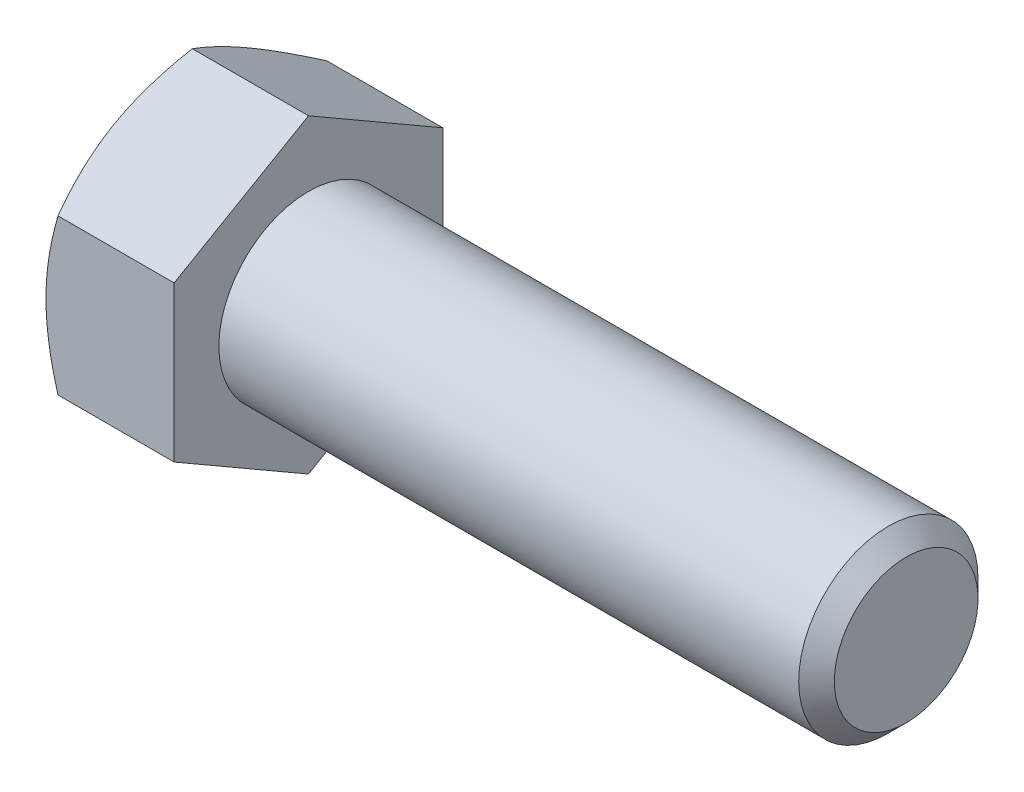
ISO-10303-21;
HEADER;
FILE_DESCRIPTION(('STEP AP214'),'2;1');
FILE_NAME('part.step','',(''),(''),'','','');
FILE_SCHEMA(('AUTOMOTIVE_DESIGN { 1 0 10303 214 1 1 1 1 }'));
ENDSEC;
DATA;
#1=APPLICATION_CONTEXT('core data for automotive mechanical design processes');
#2=APPLICATION_PROTOCOL_DEFINITION('international standard','automotive_design',2000,#1);
#3=PRODUCT_CONTEXT('',#1,'mechanical');
#4=PRODUCT('Part','Part','',(#3));
#5=PRODUCT_RELATED_PRODUCT_CATEGORY('part','',(#4));
#6=PRODUCT_DEFINITION_FORMATION('','',#4);
#7=PRODUCT_DEFINITION_CONTEXT('part definition',#1,'design');
#8=PRODUCT_DEFINITION('design','',#6,#7);
#9=PRODUCT_DEFINITION_SHAPE('','',#8);
#10=(LENGTH_UNIT() NAMED_UNIT(*) SI_UNIT(.MILLI.,.METRE.));
#11=(NAMED_UNIT(*) PLANE_ANGLE_UNIT() SI_UNIT($,.RADIAN.));
#12=(NAMED_UNIT(*) SI_UNIT($,.STERADIAN.) SOLID_ANGLE_UNIT());
#13=UNCERTAINTY_MEASURE_WITH_UNIT(LENGTH_MEASURE(1.E-05),#10,'distance_accuracy_value','');
#14=(GEOMETRIC_REPRESENTATION_CONTEXT(3) GLOBAL_UNCERTAINTY_ASSIGNED_CONTEXT((#13)) GLOBAL_UNIT_ASSIGNED_CONTEXT((#10,
#11,#12)) REPRESENTATION_CONTEXT('',''));
#15=CARTESIAN_POINT('',(0.,0.,0.));
#16=DIRECTION('',(0.,0.,1.));
#17=DIRECTION('',(1.,0.,0.));
#18=AXIS2_PLACEMENT_3D('',#15,#16,#17);
#19=CARTESIAN_POINT('',(6.8072,4.12077981131404,-7.1374));
#20=DIRECTION('',(0.,-0.866025403784438,0.500000000000001));
#21=DIRECTION('',(0.,-0.500000000000001,-0.866025403784438));
#22=AXIS2_PLACEMENT_3D('',#19,#20,#21);
#23=PLANE('',#22);
#24=CARTESIAN_POINT('',(0.637553523420351,8.24167509268192,0.0002));
#25=CARTESIAN_POINT('',(0.585265389565362,8.15109571898022,-0.15668807736911));
#26=CARTESIAN_POINT('',(0.535350289912889,8.06017862158373,-0.314161109336511));
#27=CARTESIAN_POINT('',(0.440919739394814,7.87760608276959,-0.63038602262945));
#28=CARTESIAN_POINT('',(0.396406617864106,7.78595034088605,-0.789138424377166));
#29=CARTESIAN_POINT('',(0.271843946604602,7.50951559742939,-1.26793744502137));
#30=CARTESIAN_POINT('',(0.200994122533565,7.32364541554993,-1.58987404364865));
#31=CARTESIAN_POINT('',(0.11791435726157,7.04549407114397,-2.07164630435335));
#32=CARTESIAN_POINT('',(0.094247337575371,6.95404399131372,-2.23004248897559));
#33=CARTESIAN_POINT('',(0.0545611977075681,6.77073061920728,-2.54755056317072));
#34=CARTESIAN_POINT('',(0.0385414017966375,6.67886736416473,-2.70666238825308));
#35=CARTESIAN_POINT('',(0.014557978666986,6.49498130931769,-3.02516237805155));
#36=CARTESIAN_POINT('',(0.00658520869043244,6.40295880983915,-3.18455002258785));
#37=CARTESIAN_POINT('',(-0.00114175893561165,6.21883388819857,-3.50346374180898));
#38=CARTESIAN_POINT('',(-0.000896210482457733,6.12673146859347,-3.66298981206503));
#39=CARTESIAN_POINT('',(0.0110730517201804,5.87440161908355,-4.10003793168243));
#40=CARTESIAN_POINT('',(0.0311658852990956,5.71425679021457,-4.37741691185292));
#41=CARTESIAN_POINT('',(0.0948800883359105,5.39503079963206,-4.93033254663834));
#42=CARTESIAN_POINT('',(0.138523234308964,5.23595076056063,-5.20586725678008));
#43=CARTESIAN_POINT('',(0.247618299095079,4.91608234409665,-5.75989560583231));
#44=CARTESIAN_POINT('',(0.313532435992714,4.75533432745403,-6.03831933787326));
#45=CARTESIAN_POINT('',(0.463130880450466,4.43623548204412,-6.59101475075979));
#46=CARTESIAN_POINT('',(0.546780048637375,4.27788056676997,-6.86529350964288));
#47=CARTESIAN_POINT('',(0.637553523420345,4.1206643412602,-7.1376));
#48=B_SPLINE_CURVE_WITH_KNOTS('',3,(#24,#25,#26,#27,#28,#29,#30,#31,#32,#33,#34,#35,#36,#37,#38,
#39,#40,#41,#42,#43,#44,#45,#46,#47),.UNSPECIFIED.,.F.,.F.,(4,2,2,2,2,2,2,2,2,2,2,4),(0.,
0.565616271543687,1.13147557690344,2.26554547664276,2.81869146049269,3.37178855781927,
3.9242565351942,4.47670744459711,5.43845614829341,6.40109569003608,7.3850851165131,
8.36714283329691),.UNSPECIFIED.);
#49=CARTESIAN_POINT('',(0.637486855352634,8.24155962262808,0.));
#50=VERTEX_POINT('',#49);
#51=CARTESIAN_POINT('',(0.,6.18116971697105,-3.56870000000001));
#52=VERTEX_POINT('',#51);
#53=EDGE_CURVE('E49',#50,#52,#48,.T.);
#54=ORIENTED_EDGE('',*,*,#53,.F.);
#55=DIRECTION('',(-1.,0.,0.));
#56=VECTOR('',#55,1.);
#57=CARTESIAN_POINT('',(6.8072,8.24155962262808,0.));
#58=LINE('',#57,#56);
#59=CARTESIAN_POINT('',(6.8072,8.24155962262808,0.));
#60=VERTEX_POINT('',#59);
#61=EDGE_CURVE('E145',#60,#50,#58,.T.);
#62=ORIENTED_EDGE('',*,*,#61,.F.);
#63=DIRECTION('',(0.,0.500000000000001,0.866025403784438));
#64=VECTOR('',#63,1.);
#65=CARTESIAN_POINT('',(6.8072,4.12077981131404,-7.1374));
#66=LINE('',#65,#64);
#67=CARTESIAN_POINT('',(6.8072,4.12077981131404,-7.1374));
#68=VERTEX_POINT('',#67);
#69=EDGE_CURVE('E230',#68,#60,#66,.T.);
#70=ORIENTED_EDGE('',*,*,#69,.F.);
#71=DIRECTION('',(-1.,0.,0.));
#72=VECTOR('',#71,1.);
#73=CARTESIAN_POINT('',(6.8072,4.12077981131404,-7.1374));
#74=LINE('',#73,#72);
#75=CARTESIAN_POINT('',(0.637486855352628,4.12077981131404,-7.1374));
#76=VERTEX_POINT('',#75);
#77=EDGE_CURVE('E133',#68,#76,#74,.T.);
#78=ORIENTED_EDGE('',*,*,#77,.T.);
#79=EDGE_CURVE('E127',#52,#76,#48,.T.);
#80=ORIENTED_EDGE('',*,*,#79,.F.);
#81=EDGE_LOOP('',(#54,#62,#70,#78,#80));
#82=FACE_BOUND('',#81,.T.);
#83=ADVANCED_FACE('F33',(#82),#23,.F.);
#84=CARTESIAN_POINT('',(6.8072,8.24155962262808,0.));
#85=DIRECTION('',(0.,-0.866025403784438,-0.500000000000002));
#86=DIRECTION('',(0.,0.500000000000001,-0.866025403784438));
#87=AXIS2_PLACEMENT_3D('',#84,#85,#86);
#88=PLANE('',#87);
#89=CARTESIAN_POINT('',(0.637553523420344,4.12066434126019,7.1376));
#90=CARTESIAN_POINT('',(0.585265389565355,4.21124371496189,6.98071192263089));
#91=CARTESIAN_POINT('',(0.535350289912882,4.30216081235837,6.82323889066349));
#92=CARTESIAN_POINT('',(0.440919739394807,4.48473335117252,6.50701397737055));
#93=CARTESIAN_POINT('',(0.3964066178641,4.57638909305606,6.34826157562284));
#94=CARTESIAN_POINT('',(0.271843946604597,4.85282383651272,5.86946255497863));
#95=CARTESIAN_POINT('',(0.200994122533559,5.03869401839218,5.54752595635135));
#96=CARTESIAN_POINT('',(0.117914357261565,5.31684536279813,5.06575369564665));
#97=CARTESIAN_POINT('',(0.0942473375753668,5.40829544262839,4.90735751102442));
#98=CARTESIAN_POINT('',(0.0545611977075647,5.59160881473483,4.58984943682929));
#99=CARTESIAN_POINT('',(0.0385414017966344,5.68347206977738,4.43073761174693));
#100=CARTESIAN_POINT('',(0.0145579786669831,5.86735812462442,4.11223762194846));
#101=CARTESIAN_POINT('',(0.00658520869042956,5.95938062410295,3.95284997741216));
#102=CARTESIAN_POINT('',(-0.00114175893561404,6.14350554574354,3.63393625819102));
#103=CARTESIAN_POINT('',(-0.000896210482459568,6.23560796534863,3.47441018793498));
#104=CARTESIAN_POINT('',(0.0110730517201795,6.48793781485856,3.03736206831758));
#105=CARTESIAN_POINT('',(0.0311658852990948,6.64808264372754,2.75998308814708));
#106=CARTESIAN_POINT('',(0.0948800883359104,6.96730863431005,2.20706745336167));
#107=CARTESIAN_POINT('',(0.138523234308964,7.12638867338148,1.93153274321992));
#108=CARTESIAN_POINT('',(0.247618299095081,7.44625708984547,1.37750439416769));
#109=CARTESIAN_POINT('',(0.313532435992717,7.60700510648809,1.09908066212675));
#110=CARTESIAN_POINT('',(0.463130880450471,7.926103951898,0.546385249240216));
#111=CARTESIAN_POINT('',(0.54678004863738,8.08445886717215,0.272106490357122));
#112=CARTESIAN_POINT('',(0.637553523420351,8.24167509268192,-0.00020000000000072));
#113=B_SPLINE_CURVE_WITH_KNOTS('',3,(#89,#90,#91,#92,#93,#94,#95,#96,#97,#98,#99,#100,#101,#102,
#103,#104,#105,#106,#107,#108,#109,#110,#111,#112),.UNSPECIFIED.,.F.,.F.,(4,2,2,2,2,2,2,2,2,2,2,
4),(0.,0.565616271543688,1.13147557690344,2.26554547664276,2.81869146049269,3.37178855781927,
3.92425653519419,4.4767074445971,5.43845614829341,6.40109569003608,7.38508511651311,
8.36714283329692),.UNSPECIFIED.);
#114=CARTESIAN_POINT('',(0.637486855352626,4.12077981131403,7.1374));
#115=VERTEX_POINT('',#114);
#116=CARTESIAN_POINT('',(0.,6.18116971697105,3.56870000000001));
#117=VERTEX_POINT('',#116);
#118=EDGE_CURVE('E56',#115,#117,#113,.T.);
#119=ORIENTED_EDGE('',*,*,#118,.F.);
#120=DIRECTION('',(-1.,0.,0.));
#121=VECTOR('',#120,1.);
#122=CARTESIAN_POINT('',(6.8072,4.12077981131403,7.1374));
#123=LINE('',#122,#121);
#124=CARTESIAN_POINT('',(6.8072,4.12077981131403,7.1374));
#125=VERTEX_POINT('',#124);
#126=EDGE_CURVE('E143',#125,#115,#123,.T.);
#127=ORIENTED_EDGE('',*,*,#126,.F.);
#128=DIRECTION('',(0.,-0.500000000000001,0.866025403784438));
#129=VECTOR('',#128,1.);
#130=CARTESIAN_POINT('',(6.8072,8.24155962262808,0.));
#131=LINE('',#130,#129);
#132=EDGE_CURVE('E228',#60,#125,#131,.T.);
#133=ORIENTED_EDGE('',*,*,#132,.F.);
#134=ORIENTED_EDGE('',*,*,#61,.T.);
#135=EDGE_CURVE('E160',#117,#50,#113,.T.);
#136=ORIENTED_EDGE('',*,*,#135,.F.);
#137=EDGE_LOOP('',(#119,#127,#133,#134,#136));
#138=FACE_BOUND('',#137,.T.);
#139=ADVANCED_FACE('F166',(#138),#88,.F.);
#140=CARTESIAN_POINT('',(6.8072,4.12077981131403,7.1374));
#141=DIRECTION('',(0.,0.,-1.));
#142=DIRECTION('',(-1.,0.,0.));
#143=AXIS2_PLACEMENT_3D('',#140,#141,#142);
#144=PLANE('',#143);
#145=CARTESIAN_POINT('',(3.51793891464088,-11.1403587268438,7.1374));
#146=CARTESIAN_POINT('',(3.36611761361543,-10.8279722926894,7.1374));
#147=CARTESIAN_POINT('',(3.21573167435818,-10.5148763007017,7.1374));
#148=CARTESIAN_POINT('',(2.91863653133453,-9.88688803265222,7.1374));
#149=CARTESIAN_POINT('',(2.77192789362365,-9.57199548909057,7.1374));
#150=CARTESIAN_POINT('',(2.48227074397642,-8.93844907707205,7.1374));
#151=CARTESIAN_POINT('',(2.33934643030356,-8.61978410734443,7.1374));
#152=CARTESIAN_POINT('',(2.05925336317276,-7.97994405772782,7.1374));
#153=CARTESIAN_POINT('',(1.92208434228599,-7.65876909529411,7.1374));
#154=CARTESIAN_POINT('',(1.65065378230838,-7.00284865103087,7.1374));
#155=CARTESIAN_POINT('',(1.51663374065788,-6.66800268560586,7.1374));
#156=CARTESIAN_POINT('',(1.25856485288052,-5.99442084818067,7.1374));
#157=CARTESIAN_POINT('',(1.13451711533336,-5.65568454847852,7.1374));
#158=CARTESIAN_POINT('',(0.899596727677601,-4.97438980758157,7.1374));
#159=CARTESIAN_POINT('',(0.788698036742929,-4.6318404419915,7.1374));
#160=CARTESIAN_POINT('',(0.583585288609222,-3.94184101121263,7.1374));
#161=CARTESIAN_POINT('',(0.489366053461922,-3.59439250319722,7.1374));
#162=CARTESIAN_POINT('',(0.322585119775294,-2.89623643412331,7.1374));
#163=CARTESIAN_POINT('',(0.249906108267928,-2.5455576685563,7.1374));
#164=CARTESIAN_POINT('',(0.16016292787623,-2.01629019056177,7.1374));
#165=CARTESIAN_POINT('',(0.133459926561139,-1.8393139589974,7.1374));
#166=CARTESIAN_POINT('',(0.0870009608751895,-1.48445773938037,7.1374));
#167=CARTESIAN_POINT('',(0.0672443235865605,-1.30657784056352,7.1374));
#168=CARTESIAN_POINT('',(0.0353233928817928,-0.95250904293469,7.1374));
#169=CARTESIAN_POINT('',(0.0230620606560382,-0.77632892843426,7.1374));
#170=CARTESIAN_POINT('',(0.00600431660240923,-0.423607840789688,7.1374));
#171=CARTESIAN_POINT('',(0.00120777872271323,-0.247066873789371,7.1374));
#172=CARTESIAN_POINT('',(-0.000805707966080116,0.106061109313526,7.1374));
#173=CARTESIAN_POINT('',(0.00197740745485938,0.282648125793651,7.1374));
#174=CARTESIAN_POINT('',(0.0150543642253248,0.635545980126691,7.1374));
#175=CARTESIAN_POINT('',(0.0253485677088155,0.811856804252723,7.1374));
#176=CARTESIAN_POINT('',(0.058717354667662,1.23335791869124,7.1374));
#177=CARTESIAN_POINT('',(0.0852317102922983,1.47828183508493,7.1374));
#178=CARTESIAN_POINT('',(0.151325348901077,1.96634766484072,7.1374));
#179=CARTESIAN_POINT('',(0.190906342916655,2.20948934055998,7.1374));
#180=CARTESIAN_POINT('',(0.327153349211704,2.93593608611633,7.1374));
#181=CARTESIAN_POINT('',(0.441300495017729,3.41600789467395,7.1374));
#182=CARTESIAN_POINT('',(0.639740105584508,4.13409780337109,7.1374));
#183=CARTESIAN_POINT('',(0.711386839279735,4.37582477933241,7.1374));
#184=CARTESIAN_POINT('',(0.862240726867131,4.85693123459406,7.1374));
#185=CARTESIAN_POINT('',(0.941447936163,5.09631069667747,7.1374));
#186=CARTESIAN_POINT('',(1.10614180608763,5.57279746249282,7.1374));
#187=CARTESIAN_POINT('',(1.19162653724196,5.80990543927398,7.1374));
#188=CARTESIAN_POINT('',(1.36785754588296,6.28214651090285,7.1374));
#189=CARTESIAN_POINT('',(1.45860372166629,6.51727964382363,7.1374));
#190=CARTESIAN_POINT('',(1.70099135878085,7.12822933634869,7.1374));
#191=CARTESIAN_POINT('',(1.85611245200931,7.50266378649046,7.1374));
#192=CARTESIAN_POINT('',(2.17492034788946,8.2478809422711,7.1374));
#193=CARTESIAN_POINT('',(2.33860795452499,8.61866330125996,7.1374));
#194=CARTESIAN_POINT('',(2.67260301704526,9.35737269718073,7.1374));
#195=CARTESIAN_POINT('',(2.84291264405929,9.72529874938108,7.1374));
#196=CARTESIAN_POINT('',(3.18863367809307,10.4587232704181,7.1374));
#197=CARTESIAN_POINT('',(3.36404491157501,10.8242218213111,7.1374));
#198=CARTESIAN_POINT('',(3.7191549662705,11.553777334436,7.1374));
#199=CARTESIAN_POINT('',(3.89885959822867,11.9178314626509,7.1374));
#200=CARTESIAN_POINT('',(4.26150568432078,12.6443245246618,7.1374));
#201=CARTESIAN_POINT('',(4.44444716083244,13.0067634472695,7.1374));
#202=CARTESIAN_POINT('',(4.81291716764717,13.7302353242129,7.1374));
#203=CARTESIAN_POINT('',(4.99844519827985,14.0912685333268,7.1374));
#204=CARTESIAN_POINT('',(5.37165471040538,14.8122208146436,7.1374));
#205=CARTESIAN_POINT('',(5.55933620037512,15.1721398824536,7.1374));
#206=CARTESIAN_POINT('',(6.08751400276292,16.1789579520409,7.1374));
#207=CARTESIAN_POINT('',(6.43000254365915,16.8248116492745,7.1374));
#208=CARTESIAN_POINT('',(7.11919785487999,18.1143032770824,7.1374));
#209=CARTESIAN_POINT('',(7.46590484738288,18.7579410886393,7.1374));
#210=CARTESIAN_POINT('',(8.16140637459832,20.0415314633598,7.1374));
#211=CARTESIAN_POINT('',(8.51019123426675,20.6814892741017,7.1374));
#212=CARTESIAN_POINT('',(9.21019417047446,21.9600146152104,7.1374));
#213=CARTESIAN_POINT('',(9.56141207357472,22.598582240497,7.1374));
#214=CARTESIAN_POINT('',(9.91351913441371,23.2366555668876,7.1374));
#215=B_SPLINE_CURVE_WITH_KNOTS('',3,(#145,#146,#147,#148,#149,#150,#151,#152,#153,#154,#155,
#156,#157,#158,#159,#160,#161,#162,#163,#164,#165,#166,#167,#168,#169,#170,#171,#172,#173,#174,
#175,#176,#177,#178,#179,#180,#181,#182,#183,#184,#185,#186,#187,#188,#189,#190,#191,#192,#193,
#194,#195,#196,#197,#198,#199,#200,#201,#202,#203,#204,#205,#206,#207,#208,#209,#210,#211,#212,
#213,#214),.UNSPECIFIED.,.F.,.F.,(4,2,2,2,2,2,2,2,2,2,2,2,2,2,2,2,2,2,2,2,2,2,2,2,2,2,2,2,2,2,2,
2,2,2,4),(0.,1.0419888362068,2.08413709519682,3.13183784368232,4.17948985504912,
5.26137797247103,6.34338619307612,7.423214449961,8.50270689628369,9.57620733057733,
10.113030795566,10.6498022423129,11.179468394122,11.7091256017988,12.2387872978086,
12.7684745322176,13.507123574382,14.245869378494,15.7241255438818,16.4804246089875,
17.2367292167316,17.9928023300467,18.7488608333938,19.9645892594812,21.1804319893616,
22.3966767697582,23.6128802262777,24.8308351286452,26.0487984545625,27.2665296678531,
28.4842656762731,30.6773737382256,32.8705978115956,35.0570894097065,37.2434267159856),.UNSPECIFIED.);
#216=CARTESIAN_POINT('',(0.637486855352634,-4.12077981131405,7.1374));
#217=VERTEX_POINT('',#216);
#218=CARTESIAN_POINT('',(0.,0.,7.1374));
#219=VERTEX_POINT('',#218);
#220=EDGE_CURVE('E240',#217,#219,#215,.T.);
#221=ORIENTED_EDGE('',*,*,#220,.F.);
#222=DIRECTION('',(-1.,0.,0.));
#223=VECTOR('',#222,1.);
#224=CARTESIAN_POINT('',(6.8072,-4.12077981131405,7.1374));
#225=LINE('',#224,#223);
#226=CARTESIAN_POINT('',(6.8072,-4.12077981131405,7.1374));
#227=VERTEX_POINT('',#226);
#228=EDGE_CURVE('E135',#227,#217,#225,.T.);
#229=ORIENTED_EDGE('',*,*,#228,.F.);
#230=DIRECTION('',(0.,-1.,0.));
#231=VECTOR('',#230,1.);
#232=CARTESIAN_POINT('',(6.8072,4.12077981131403,7.1374));
#233=LINE('',#232,#231);
#234=EDGE_CURVE('E224',#125,#227,#233,.T.);
#235=ORIENTED_EDGE('',*,*,#234,.F.);
#236=ORIENTED_EDGE('',*,*,#126,.T.);
#237=EDGE_CURVE('E182',#219,#115,#215,.T.);
#238=ORIENTED_EDGE('',*,*,#237,.F.);
#239=EDGE_LOOP('',(#221,#229,#235,#236,#238));
#240=FACE_BOUND('',#239,.T.);
#241=ADVANCED_FACE('F246',(#240),#144,.F.);
#242=CARTESIAN_POINT('',(6.8072,-8.2415596226281,0.));
#243=DIRECTION('',(0.,0.866025403784438,-0.500000000000001));
#244=DIRECTION('',(0.,0.500000000000001,0.866025403784438));
#245=AXIS2_PLACEMENT_3D('',#242,#243,#244);
#246=PLANE('',#245);
#247=CARTESIAN_POINT('',(0.63755352342036,-8.24167509268193,-0.000200000000000264));
#248=CARTESIAN_POINT('',(0.58526538956537,-8.15109571898024,0.15668807736911));
#249=CARTESIAN_POINT('',(0.535350289912898,-8.06017862158375,0.314161109336512));
#250=CARTESIAN_POINT('',(0.440919739394822,-7.8776060827696,0.630386022629451));
#251=CARTESIAN_POINT('',(0.396406617864115,-7.78595034088606,0.789138424377167));
#252=CARTESIAN_POINT('',(0.271843946604611,-7.5095155974294,1.26793744502137));
#253=CARTESIAN_POINT('',(0.200994122533572,-7.32364541554995,1.58987404364865));
#254=CARTESIAN_POINT('',(0.117914357261578,-7.04549407114399,2.07164630435336));
#255=CARTESIAN_POINT('',(0.0942473375753794,-6.95404399131373,2.23004248897559));
#256=CARTESIAN_POINT('',(0.0545611977075762,-6.77073061920729,2.54755056317072));
#257=CARTESIAN_POINT('',(0.0385414017966451,-6.67886736416474,2.70666238825308));
#258=CARTESIAN_POINT('',(0.0145579786669934,-6.4949813093177,3.02516237805155));
#259=CARTESIAN_POINT('',(0.00658520869044011,-6.40295880983917,3.18455002258785));
#260=CARTESIAN_POINT('',(-0.00114175893560356,-6.21883388819858,3.50346374180899));
#261=CARTESIAN_POINT('',(-0.000896210482449448,-6.12673146859349,3.66298981206504));
#262=CARTESIAN_POINT('',(0.0110730517201889,-5.87440161908356,4.10003793168243));
#263=CARTESIAN_POINT('',(0.0311658852991039,-5.71425679021458,4.37741691185293));
#264=CARTESIAN_POINT('',(0.0948800883359182,-5.39503079963207,4.93033254663834));
#265=CARTESIAN_POINT('',(0.138523234308971,-5.23595076056065,5.20586725678009));
#266=CARTESIAN_POINT('',(0.247618299095086,-4.91608234409666,5.75989560583231));
#267=CARTESIAN_POINT('',(0.313532435992721,-4.75533432745404,6.03831933787326));
#268=CARTESIAN_POINT('',(0.463130880450472,-4.43623548204413,6.59101475075979));
#269=CARTESIAN_POINT('',(0.546780048637381,-4.27788056676998,6.86529350964288));
#270=CARTESIAN_POINT('',(0.637553523420351,-4.12066434126022,7.1376));
#271=B_SPLINE_CURVE_WITH_KNOTS('',3,(#247,#248,#249,#250,#251,#252,#253,#254,#255,#256,#257,
#258,#259,#260,#261,#262,#263,#264,#265,#266,#267,#268,#269,#270),.UNSPECIFIED.,.F.,.F.,(4,2,2,
2,2,2,2,2,2,2,2,4),(0.,0.565616271543688,1.13147557690344,2.26554547664277,2.81869146049269,
3.37178855781928,3.92425653519421,4.47670744459712,5.43845614829342,6.40109569003608,
7.38508511651311,8.36714283329691),.UNSPECIFIED.);
#272=CARTESIAN_POINT('',(0.637486855352643,-8.2415596226281,0.));
#273=VERTEX_POINT('',#272);
#274=CARTESIAN_POINT('',(0.,-6.18116971697105,3.5687));
#275=VERTEX_POINT('',#274);
#276=EDGE_CURVE('E168',#273,#275,#271,.T.);
#277=ORIENTED_EDGE('',*,*,#276,.F.);
#278=DIRECTION('',(-1.,0.,0.));
#279=VECTOR('',#278,1.);
#280=CARTESIAN_POINT('',(6.8072,-8.2415596226281,0.));
#281=LINE('',#280,#279);
#282=CARTESIAN_POINT('',(6.8072,-8.2415596226281,0.));
#283=VERTEX_POINT('',#282);
#284=EDGE_CURVE('E132',#283,#273,#281,.T.);
#285=ORIENTED_EDGE('',*,*,#284,.F.);
#286=DIRECTION('',(0.,-0.500000000000001,-0.866025403784438));
#287=VECTOR('',#286,1.);
#288=CARTESIAN_POINT('',(6.8072,-8.2415596226281,0.));
#289=LINE('',#288,#287);
#290=EDGE_CURVE('E222',#227,#283,#289,.T.);
#291=ORIENTED_EDGE('',*,*,#290,.F.);
#292=ORIENTED_EDGE('',*,*,#228,.T.);
#293=EDGE_CURVE('E170',#275,#217,#271,.T.);
#294=ORIENTED_EDGE('',*,*,#293,.F.);
#295=EDGE_LOOP('',(#277,#285,#291,#292,#294));
#296=FACE_BOUND('',#295,.T.);
#297=ADVANCED_FACE('F218',(#296),#246,.F.);
#298=CARTESIAN_POINT('',(6.8072,-4.12077981131404,-7.1374));
#299=DIRECTION('',(0.,0.866025403784438,0.500000000000002));
#300=DIRECTION('',(0.,-0.500000000000001,0.866025403784438));
#301=AXIS2_PLACEMENT_3D('',#298,#299,#300);
#302=PLANE('',#301);
#303=CARTESIAN_POINT('',(0.637553523420348,-4.12066434126021,-7.1376));
#304=CARTESIAN_POINT('',(0.585265389565359,-4.2112437149619,-6.98071192263089));
#305=CARTESIAN_POINT('',(0.535350289912887,-4.30216081235839,-6.82323889066349));
#306=CARTESIAN_POINT('',(0.440919739394812,-4.48473335117254,-6.50701397737055));
#307=CARTESIAN_POINT('',(0.396406617864105,-4.57638909305608,-6.34826157562284));
#308=CARTESIAN_POINT('',(0.271843946604603,-4.85282383651274,-5.86946255497863));
#309=CARTESIAN_POINT('',(0.200994122533566,-5.03869401839219,-5.54752595635135));
#310=CARTESIAN_POINT('',(0.117914357261572,-5.31684536279815,-5.06575369564665));
#311=CARTESIAN_POINT('',(0.0942473375753734,-5.40829544262841,-4.90735751102442));
#312=CARTESIAN_POINT('',(0.054561197707571,-5.59160881473485,-4.58984943682928));
#313=CARTESIAN_POINT('',(0.0385414017966407,-5.6834720697774,-4.43073761174692));
#314=CARTESIAN_POINT('',(0.01455797866699,-5.86735812462444,-4.11223762194846));
#315=CARTESIAN_POINT('',(0.00658520869043696,-5.95938062410297,-3.95284997741216));
#316=CARTESIAN_POINT('',(-0.00114175893560615,-6.14350554574356,-3.63393625819102));
#317=CARTESIAN_POINT('',(-0.000896210482451765,-6.23560796534865,-3.47441018793497));
#318=CARTESIAN_POINT('',(0.0110730517201875,-6.48793781485858,-3.03736206831758));
#319=CARTESIAN_POINT('',(0.0311658852991034,-6.64808264372756,-2.75998308814708));
#320=CARTESIAN_POINT('',(0.0948800883359196,-6.96730863431007,-2.20706745336167));
#321=CARTESIAN_POINT('',(0.138523234308974,-7.1263886733815,-1.93153274321992));
#322=CARTESIAN_POINT('',(0.24761829909509,-7.44625708984548,-1.37750439416769));
#323=CARTESIAN_POINT('',(0.313532435992726,-7.60700510648811,-1.09908066212674));
#324=CARTESIAN_POINT('',(0.46313088045048,-7.92610395189802,-0.546385249240216));
#325=CARTESIAN_POINT('',(0.546780048637389,-8.08445886717217,-0.272106490357123));
#326=CARTESIAN_POINT('',(0.63755352342036,-8.24167509268193,0.000199999999999767));
#327=B_SPLINE_CURVE_WITH_KNOTS('',3,(#303,#304,#305,#306,#307,#308,#309,#310,#311,#312,#313,
#314,#315,#316,#317,#318,#319,#320,#321,#322,#323,#324,#325,#326),.UNSPECIFIED.,.F.,.F.,(4,2,2,
2,2,2,2,2,2,2,2,4),(0.,0.565616271543686,1.13147557690344,2.26554547664276,2.81869146049269,
3.37178855781927,3.9242565351942,4.47670744459711,5.43845614829341,6.40109569003608,
7.38508511651311,8.36714283329691),.UNSPECIFIED.);
#328=CARTESIAN_POINT('',(0.637486855352631,-4.12077981131404,-7.1374));
#329=VERTEX_POINT('',#328);
#330=CARTESIAN_POINT('',(0.,-6.18116971697105,-3.56870000000001));
#331=VERTEX_POINT('',#330);
#332=EDGE_CURVE('E109',#329,#331,#327,.T.);
#333=ORIENTED_EDGE('',*,*,#332,.F.);
#334=DIRECTION('',(-1.,0.,0.));
#335=VECTOR('',#334,1.);
#336=CARTESIAN_POINT('',(6.8072,-4.12077981131404,-7.1374));
#337=LINE('',#336,#335);
#338=CARTESIAN_POINT('',(6.8072,-4.12077981131404,-7.1374));
#339=VERTEX_POINT('',#338);
#340=EDGE_CURVE('E123',#339,#329,#337,.T.);
#341=ORIENTED_EDGE('',*,*,#340,.F.);
#342=DIRECTION('',(0.,0.500000000000001,-0.866025403784438));
#343=VECTOR('',#342,1.);
#344=CARTESIAN_POINT('',(6.8072,-4.12077981131404,-7.1374));
#345=LINE('',#344,#343);
#346=EDGE_CURVE('E220',#283,#339,#345,.T.);
#347=ORIENTED_EDGE('',*,*,#346,.F.);
#348=ORIENTED_EDGE('',*,*,#284,.T.);
#349=EDGE_CURVE('E126',#331,#273,#327,.T.);
#350=ORIENTED_EDGE('',*,*,#349,.F.);
#351=EDGE_LOOP('',(#333,#341,#347,#348,#350));
#352=FACE_BOUND('',#351,.T.);
#353=ADVANCED_FACE('F121',(#352),#302,.F.);
#354=CARTESIAN_POINT('',(6.8072,4.12077981131404,-7.1374));
#355=DIRECTION('',(0.,0.,1.));
#356=DIRECTION('',(0.,-1.,0.));
#357=AXIS2_PLACEMENT_3D('',#354,#355,#356);
#358=PLANE('',#357);
#359=CARTESIAN_POINT('',(3.5179389152916,-11.1403587281823,-7.1374));
#360=CARTESIAN_POINT('',(3.36611761423896,-10.8279722939829,-7.1374));
#361=CARTESIAN_POINT('',(3.21573167495453,-10.5148763019502,-7.1374));
#362=CARTESIAN_POINT('',(2.91863653187666,-9.88688803381043,-7.1374));
#363=CARTESIAN_POINT('',(2.77192789413874,-9.57199549020358,-7.1374));
#364=CARTESIAN_POINT('',(2.4822707444374,-8.93844907809396,-7.1374));
#365=CARTESIAN_POINT('',(2.33934643073749,-8.61978410832044,-7.1374));
#366=CARTESIAN_POINT('',(2.05925336355302,-7.97994405861171,-7.1374));
#367=CARTESIAN_POINT('',(1.92208434263963,-7.65876909613179,-7.1374));
#368=CARTESIAN_POINT('',(1.6506537826081,-7.00284865177263,-7.1374));
#369=CARTESIAN_POINT('',(1.51663374093034,-6.66800268629789,-7.1374));
#370=CARTESIAN_POINT('',(1.25856485309992,-5.99442084877244,-7.1374));
#371=CARTESIAN_POINT('',(1.13451711552696,-5.65568454901976,-7.1374));
#372=CARTESIAN_POINT('',(0.899596727822089,-4.97438980802079,-7.1374));
#373=CARTESIAN_POINT('',(0.788698036864094,-4.63184044237925,-7.1374));
#374=CARTESIAN_POINT('',(0.58358528868757,-3.94184101149604,-7.1374));
#375=CARTESIAN_POINT('',(0.48936605352077,-3.59439250342776,-7.1374));
#376=CARTESIAN_POINT('',(0.322585119794831,-2.89623643422077,-7.1374));
#377=CARTESIAN_POINT('',(0.24990610826918,-2.54555766857317,-7.1374));
#378=CARTESIAN_POINT('',(0.160162927859163,-2.01629019045636,-7.1374));
#379=CARTESIAN_POINT('',(0.133459926539485,-1.83931395885101,-7.1374));
#380=CARTESIAN_POINT('',(0.0870009608477341,-1.48445773915167,-7.1374));
#381=CARTESIAN_POINT('',(0.0672443235578908,-1.3065778402935,-7.1374));
#382=CARTESIAN_POINT('',(0.0353233928543441,-0.952509042582881,-7.1374));
#383=CARTESIAN_POINT('',(0.0230620606309587,-0.776328928041984,-7.1374));
#384=CARTESIAN_POINT('',(0.00600431658563626,-0.423607840316563,-7.1374));
#385=CARTESIAN_POINT('',(0.00120777871187736,-0.247066873275865,-7.1374));
#386=CARTESIAN_POINT('',(-0.000805707961560371,0.10606110990749,-7.1374));
#387=CARTESIAN_POINT('',(0.0019774074687984,0.282648126427692,-7.1374));
#388=CARTESIAN_POINT('',(0.0150543642613317,0.63554598084036,-7.1374));
#389=CARTESIAN_POINT('',(0.0253485677574713,0.811856805005944,-7.1374));
#390=CARTESIAN_POINT('',(0.05871735474743,1.2333579195058,-7.1374));
#391=CARTESIAN_POINT('',(0.0852317103899933,1.47828183592109,-7.1374));
#392=CARTESIAN_POINT('',(0.151325349035589,1.96634766571914,-7.1374));
#393=CARTESIAN_POINT('',(0.190906343070057,2.20948934145904,-7.1374));
#394=CARTESIAN_POINT('',(0.327153349422178,2.93593608707619,-7.1374));
#395=CARTESIAN_POINT('',(0.441300495266761,3.41600789567278,-7.1374));
#396=CARTESIAN_POINT('',(0.639740105890458,4.13409780442822,-7.1374));
#397=CARTESIAN_POINT('',(0.71138683960479,4.37582478040938,-7.1374));
#398=CARTESIAN_POINT('',(0.862240727229824,4.8569312357105,-7.1374));
#399=CARTESIAN_POINT('',(0.941447936544224,5.09631069781353,-7.1374));
#400=CARTESIAN_POINT('',(1.10614180650527,5.57279746366798,-7.1374));
#401=CARTESIAN_POINT('',(1.19162653767747,5.80990544046863,-7.1374));
#402=CARTESIAN_POINT('',(1.36785754635362,6.28214651213647,-7.1374));
#403=CARTESIAN_POINT('',(1.45860372215422,6.51727964507673,-7.1374));
#404=CARTESIAN_POINT('',(1.70099135929758,7.12822933761361,-7.1374));
#405=CARTESIAN_POINT('',(1.85611245253595,7.50266378774821,-7.1374));
#406=CARTESIAN_POINT('',(2.17492034843319,8.24788094351541,-7.1374));
#407=CARTESIAN_POINT('',(2.3386079550759,8.618663302498,-7.1374));
#408=CARTESIAN_POINT('',(2.6726030176085,9.35737269840689,-7.1374));
#409=CARTESIAN_POINT('',(2.84291264462769,9.72529875060163,-7.1374));
#410=CARTESIAN_POINT('',(3.18863367867035,10.4587232716281,-7.1374));
#411=CARTESIAN_POINT('',(3.36404491215601,10.8242218225161,-7.1374));
#412=CARTESIAN_POINT('',(3.71915496685772,11.5537773356311,-7.1374));
#413=CARTESIAN_POINT('',(3.8988595988184,11.9178314638411,-7.1374));
#414=CARTESIAN_POINT('',(4.2615056849147,12.6443245258428,-7.1374));
#415=CARTESIAN_POINT('',(4.44444716142806,13.006763448446,-7.1374));
#416=CARTESIAN_POINT('',(4.81291716824558,13.7302353253808,-7.1374));
#417=CARTESIAN_POINT('',(4.99844519887936,14.0912685344906,-7.1374));
#418=CARTESIAN_POINT('',(5.3716547110066,14.8122208157994,-7.1374));
#419=CARTESIAN_POINT('',(5.55933620097696,15.1721398836055,-7.1374));
#420=CARTESIAN_POINT('',(6.08751400336934,16.1789579531885,-7.1374));
#421=CARTESIAN_POINT('',(6.43000254426918,16.824811650422,-7.1374));
#422=CARTESIAN_POINT('',(7.11919785549649,18.1143032782298,-7.1374));
#423=CARTESIAN_POINT('',(7.46590484800225,18.757941089787,-7.1374));
#424=CARTESIAN_POINT('',(8.1614063752235,20.0415314645091,-7.1374));
#425=CARTESIAN_POINT('',(8.51019123489487,20.6814892752524,-7.1374));
#426=CARTESIAN_POINT('',(9.21019417110813,21.9600146163643,-7.1374));
#427=CARTESIAN_POINT('',(9.56141207421099,22.5985822416527,-7.1374));
#428=CARTESIAN_POINT('',(9.91351913505248,23.236655568045,-7.1374));
#429=B_SPLINE_CURVE_WITH_KNOTS('',3,(#359,#360,#361,#362,#363,#364,#365,#366,#367,#368,#369,
#370,#371,#372,#373,#374,#375,#376,#377,#378,#379,#380,#381,#382,#383,#384,#385,#386,#387,#388,
#389,#390,#391,#392,#393,#394,#395,#396,#397,#398,#399,#400,#401,#402,#403,#404,#405,#406,#407,
#408,#409,#410,#411,#412,#413,#414,#415,#416,#417,#418,#419,#420,#421,#422,#423,#424,#425,#426,
#427,#428),.UNSPECIFIED.,.F.,.F.,(4,2,2,2,2,2,2,2,2,2,2,2,2,2,2,2,2,2,2,2,2,2,2,2,2,2,2,2,2,2,2,
2,2,2,4),(0.,1.04198883636395,2.08413709551115,3.13183784415551,4.17948985568116,
5.26137797327196,6.34338619404598,7.42321445109923,8.50270689759015,9.57620733213104,
10.1130307972433,10.6498022441137,11.1794683960433,11.7091256038406,12.2387872999709,
12.7684745345005,13.507123576735,14.2458693809173,15.7241255464457,16.4804246116249,
17.2367292194424,17.9928023328306,18.7488608362509,19.9645892623299,21.1804319922018,
22.3966767725898,23.6128802291005,24.8308351314584,26.048798457366,27.2665296706471,
28.4842656790576,30.6773737410147,32.8705978143893,35.0570894125083,37.2434267187957),.UNSPECIFIED.);
#430=CARTESIAN_POINT('',(0.,0.,-7.1374));
#431=VERTEX_POINT('',#430);
#432=EDGE_CURVE('E115',#76,#431,#429,.F.);
#433=ORIENTED_EDGE('',*,*,#432,.F.);
#434=ORIENTED_EDGE('',*,*,#77,.F.);
#435=DIRECTION('',(0.,1.,0.));
#436=VECTOR('',#435,1.);
#437=CARTESIAN_POINT('',(6.8072,4.12077981131404,-7.1374));
#438=LINE('',#437,#436);
#439=EDGE_CURVE('E131',#339,#68,#438,.T.);
#440=ORIENTED_EDGE('',*,*,#439,.F.);
#441=ORIENTED_EDGE('',*,*,#340,.T.);
#442=EDGE_CURVE('E106',#431,#329,#429,.F.);
#443=ORIENTED_EDGE('',*,*,#442,.F.);
#444=EDGE_LOOP('',(#433,#434,#440,#441,#443));
#445=FACE_BOUND('',#444,.T.);
#446=ADVANCED_FACE('F129',(#445),#358,.F.);
#447=CARTESIAN_POINT('',(6.8072,8.24155962262808,0.));
#448=DIRECTION('',(1.,0.,0.));
#449=DIRECTION('',(0.,0.,-1.));
#450=AXIS2_PLACEMENT_3D('',#447,#448,#449);
#451=PLANE('',#450);
#452=CARTESIAN_POINT('',(6.8072,0.,0.));
#453=DIRECTION('',(1.,0.,0.));
#454=DIRECTION('',(0.,0.,-1.));
#455=AXIS2_PLACEMENT_3D('',#452,#453,#454);
#456=CIRCLE('',#455,4.7625);
#457=CARTESIAN_POINT('',(6.8072,0.,-4.7625));
#458=VERTEX_POINT('',#457);
#459=EDGE_CURVE('E233',#458,#458,#456,.F.);
#460=ORIENTED_EDGE('',*,*,#459,.T.);
#461=EDGE_LOOP('',(#460));
#462=FACE_BOUND('',#461,.T.);
#463=ORIENTED_EDGE('',*,*,#69,.T.);
#464=ORIENTED_EDGE('',*,*,#132,.T.);
#465=ORIENTED_EDGE('',*,*,#234,.T.);
#466=ORIENTED_EDGE('',*,*,#290,.T.);
#467=ORIENTED_EDGE('',*,*,#346,.T.);
#468=ORIENTED_EDGE('',*,*,#439,.T.);
#469=EDGE_LOOP('',(#463,#464,#465,#466,#467,#468));
#470=FACE_BOUND('',#469,.T.);
#471=ADVANCED_FACE('F248',(#462,#470),#451,.T.);
#472=CARTESIAN_POINT('',(0.,0.,0.));
#473=DIRECTION('',(-1.,0.,0.));
#474=DIRECTION('',(0.,0.,1.));
#475=AXIS2_PLACEMENT_3D('',#472,#473,#474);
#476=CYLINDRICAL_SURFACE('',#475,4.7625);
#477=ORIENTED_EDGE('',*,*,#459,.F.);
#478=EDGE_LOOP('',(#477));
#479=FACE_BOUND('',#478,.T.);
#480=CARTESIAN_POINT('',(37.61105,0.,0.));
#481=DIRECTION('',(-1.,0.,0.));
#482=DIRECTION('',(0.,0.,1.));
#483=AXIS2_PLACEMENT_3D('',#480,#481,#482);
#484=CIRCLE('',#483,4.7625);
#485=CARTESIAN_POINT('',(37.61105,0.,4.7625));
#486=VERTEX_POINT('',#485);
#487=EDGE_CURVE('E236',#486,#486,#484,.T.);
#488=ORIENTED_EDGE('',*,*,#487,.T.);
#489=EDGE_LOOP('',(#488));
#490=FACE_BOUND('',#489,.T.);
#491=ADVANCED_FACE('F279',(#479,#490),#476,.T.);
#492=CARTESIAN_POINT('',(38.5572,0.,0.));
#493=DIRECTION('',(-1.,0.,0.));
#494=DIRECTION('',(0.,0.,1.));
#495=AXIS2_PLACEMENT_3D('',#492,#493,#494);
#496=CONICAL_SURFACE('',#495,3.81635,0.785398163397461);
#497=ORIENTED_EDGE('',*,*,#487,.F.);
#498=EDGE_LOOP('',(#497));
#499=FACE_BOUND('',#498,.T.);
#500=CARTESIAN_POINT('',(38.5572,0.,0.));
#501=DIRECTION('',(-1.,0.,0.));
#502=DIRECTION('',(0.,0.,1.));
#503=AXIS2_PLACEMENT_3D('',#500,#501,#502);
#504=CIRCLE('',#503,3.81635);
#505=CARTESIAN_POINT('',(38.5572,0.,3.81635));
#506=VERTEX_POINT('',#505);
#507=EDGE_CURVE('E238',#506,#506,#504,.T.);
#508=ORIENTED_EDGE('',*,*,#507,.T.);
#509=EDGE_LOOP('',(#508));
#510=FACE_BOUND('',#509,.T.);
#511=ADVANCED_FACE('F282',(#499,#510),#496,.T.);
#512=CARTESIAN_POINT('',(38.5572,0.,0.));
#513=DIRECTION('',(-1.,0.,0.));
#514=DIRECTION('',(0.,0.,1.));
#515=AXIS2_PLACEMENT_3D('',#512,#513,#514);
#516=PLANE('',#515);
#517=ORIENTED_EDGE('',*,*,#507,.F.);
#518=EDGE_LOOP('',(#517));
#519=FACE_BOUND('',#518,.T.);
#520=ADVANCED_FACE('F195',(#519),#516,.F.);
#521=CARTESIAN_POINT('',(0.,0.,0.));
#522=DIRECTION('',(1.,0.,0.));
#523=DIRECTION('',(0.,0.,-1.));
#524=AXIS2_PLACEMENT_3D('',#521,#522,#523);
#525=CONICAL_SURFACE('',#524,7.1374,1.0471975511966);
#526=ORIENTED_EDGE('',*,*,#332,.T.);
#527=CARTESIAN_POINT('',(0.,0.,0.));
#528=DIRECTION('',(1.,0.,0.));
#529=DIRECTION('',(0.,0.,-1.));
#530=AXIS2_PLACEMENT_3D('',#527,#528,#529);
#531=CIRCLE('',#530,7.1374);
#532=EDGE_CURVE('E37',#331,#431,#531,.T.);
#533=ORIENTED_EDGE('',*,*,#532,.T.);
#534=ORIENTED_EDGE('',*,*,#442,.T.);
#535=EDGE_LOOP('',(#526,#533,#534));
#536=FACE_BOUND('',#535,.T.);
#537=ADVANCED_FACE('F108',(#536),#525,.T.);
#538=ORIENTED_EDGE('',*,*,#276,.T.);
#539=EDGE_CURVE('E150',#275,#331,#531,.T.);
#540=ORIENTED_EDGE('',*,*,#539,.T.);
#541=ORIENTED_EDGE('',*,*,#349,.T.);
#542=EDGE_LOOP('',(#538,#540,#541));
#543=FACE_BOUND('',#542,.T.);
#544=ADVANCED_FACE('F194',(#543),#525,.T.);
#545=ORIENTED_EDGE('',*,*,#220,.T.);
#546=EDGE_CURVE('E151',#219,#275,#531,.T.);
#547=ORIENTED_EDGE('',*,*,#546,.T.);
#548=ORIENTED_EDGE('',*,*,#293,.T.);
#549=EDGE_LOOP('',(#545,#547,#548));
#550=FACE_BOUND('',#549,.T.);
#551=ADVANCED_FACE('F189',(#550),#525,.T.);
#552=ORIENTED_EDGE('',*,*,#237,.T.);
#553=ORIENTED_EDGE('',*,*,#118,.T.);
#554=CARTESIAN_POINT('',(0.,0.,0.));
#555=DIRECTION('',(-1.,0.,0.));
#556=DIRECTION('',(0.,0.,1.));
#557=AXIS2_PLACEMENT_3D('',#554,#555,#556);
#558=CIRCLE('',#557,7.1374);
#559=EDGE_CURVE('E116',#219,#117,#558,.T.);
#560=ORIENTED_EDGE('',*,*,#559,.F.);
#561=EDGE_LOOP('',(#552,#553,#560));
#562=FACE_BOUND('',#561,.T.);
#563=ADVANCED_FACE('F193',(#562),#525,.T.);
#564=ORIENTED_EDGE('',*,*,#135,.T.);
#565=ORIENTED_EDGE('',*,*,#53,.T.);
#566=EDGE_CURVE('E42',#52,#117,#531,.T.);
#567=ORIENTED_EDGE('',*,*,#566,.T.);
#568=EDGE_LOOP('',(#564,#565,#567));
#569=FACE_BOUND('',#568,.T.);
#570=ADVANCED_FACE('F159',(#569),#525,.T.);
#571=ORIENTED_EDGE('',*,*,#79,.T.);
#572=ORIENTED_EDGE('',*,*,#432,.T.);
#573=EDGE_CURVE('E11',#431,#52,#531,.T.);
#574=ORIENTED_EDGE('',*,*,#573,.T.);
#575=EDGE_LOOP('',(#571,#572,#574));
#576=FACE_BOUND('',#575,.T.);
#577=ADVANCED_FACE('F251',(#576),#525,.T.);
#578=CARTESIAN_POINT('',(0.,8.24155962262808,0.));
#579=DIRECTION('',(1.,0.,0.));
#580=DIRECTION('',(0.,0.,-1.));
#581=AXIS2_PLACEMENT_3D('',#578,#579,#580);
#582=PLANE('',#581);
#583=ORIENTED_EDGE('',*,*,#573,.F.);
#584=ORIENTED_EDGE('',*,*,#532,.F.);
#585=ORIENTED_EDGE('',*,*,#539,.F.);
#586=ORIENTED_EDGE('',*,*,#546,.F.);
#587=ORIENTED_EDGE('',*,*,#559,.T.);
#588=ORIENTED_EDGE('',*,*,#566,.F.);
#589=EDGE_LOOP('',(#583,#584,#585,#586,#587,#588));
#590=FACE_BOUND('',#589,.T.);
#591=ADVANCED_FACE('F163',(#590),#582,.F.);
#592=CLOSED_SHELL('',(#83,#139,#241,#297,#353,#446,#471,#491,#511,#520,#537,#544,#551,#563,#570,
#577,#591));
#593=MANIFOLD_SOLID_BREP('B2',#592);
#594=ADVANCED_BREP_SHAPE_REPRESENTATION('',(#18,#593),#14);
#595=SHAPE_DEFINITION_REPRESENTATION(#9,#594);
ENDSEC;
END-ISO-10303-21;
